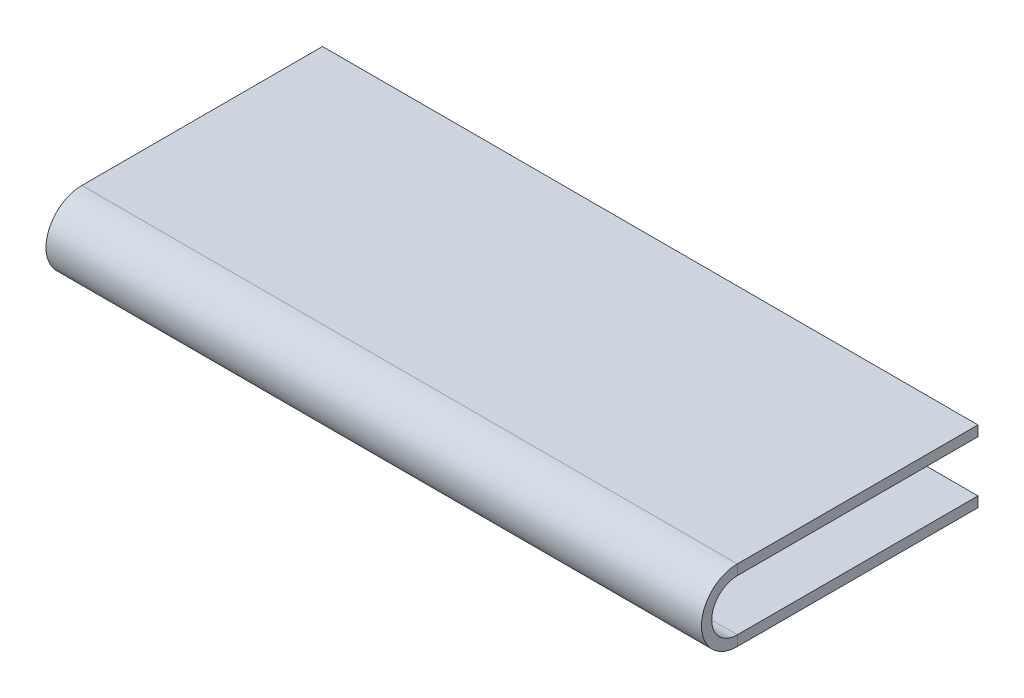
ISO-10303-21;
HEADER;
FILE_DESCRIPTION(('STEP AP214'),'2;1');
FILE_NAME('part.step','',(''),(''),'','','');
FILE_SCHEMA(('AUTOMOTIVE_DESIGN { 1 0 10303 214 1 1 1 1 }'));
ENDSEC;
DATA;
#1=APPLICATION_CONTEXT('core data for automotive mechanical design processes');
#2=APPLICATION_PROTOCOL_DEFINITION('international standard','automotive_design',2000,#1);
#3=PRODUCT_CONTEXT('',#1,'mechanical');
#4=PRODUCT('Part','Part','',(#3));
#5=PRODUCT_RELATED_PRODUCT_CATEGORY('part','',(#4));
#6=PRODUCT_DEFINITION_FORMATION('','',#4);
#7=PRODUCT_DEFINITION_CONTEXT('part definition',#1,'design');
#8=PRODUCT_DEFINITION('design','',#6,#7);
#9=PRODUCT_DEFINITION_SHAPE('','',#8);
#10=(LENGTH_UNIT() NAMED_UNIT(*) SI_UNIT(.MILLI.,.METRE.));
#11=(NAMED_UNIT(*) PLANE_ANGLE_UNIT() SI_UNIT($,.RADIAN.));
#12=(NAMED_UNIT(*) SI_UNIT($,.STERADIAN.) SOLID_ANGLE_UNIT());
#13=UNCERTAINTY_MEASURE_WITH_UNIT(LENGTH_MEASURE(1.E-05),#10,'distance_accuracy_value','');
#14=(GEOMETRIC_REPRESENTATION_CONTEXT(3) GLOBAL_UNCERTAINTY_ASSIGNED_CONTEXT((#13)) GLOBAL_UNIT_ASSIGNED_CONTEXT((#10,
#11,#12)) REPRESENTATION_CONTEXT('',''));
#15=CARTESIAN_POINT('',(0.,0.,0.));
#16=DIRECTION('',(0.,0.,1.));
#17=DIRECTION('',(1.,0.,0.));
#18=AXIS2_PLACEMENT_3D('',#15,#16,#17);
#19=CARTESIAN_POINT('',(64.,0.,23.5));
#20=DIRECTION('',(1.,0.,0.));
#21=DIRECTION('',(0.,0.,-1.));
#22=AXIS2_PLACEMENT_3D('',#19,#20,#21);
#23=PLANE('',#22);
#24=DIRECTION('',(0.,-1.,0.));
#25=VECTOR('',#24,1.);
#26=CARTESIAN_POINT('',(64.,0.,23.5));
#27=LINE('',#26,#25);
#28=CARTESIAN_POINT('',(64.,0.,23.5));
#29=VERTEX_POINT('',#28);
#30=CARTESIAN_POINT('',(64.,-0.999999999999999,23.5));
#31=VERTEX_POINT('',#30);
#32=EDGE_CURVE('E11',#29,#31,#27,.T.);
#33=ORIENTED_EDGE('',*,*,#32,.F.);
#34=CARTESIAN_POINT('',(64.,2.5,23.5));
#35=DIRECTION('',(1.,0.,0.));
#36=DIRECTION('',(0.,0.,-1.));
#37=AXIS2_PLACEMENT_3D('',#34,#35,#36);
#38=CIRCLE('',#37,2.5);
#39=CARTESIAN_POINT('',(64.,4.99999999999999,23.5));
#40=VERTEX_POINT('',#39);
#41=EDGE_CURVE('E137',#40,#29,#38,.T.);
#42=ORIENTED_EDGE('',*,*,#41,.F.);
#43=DIRECTION('',(0.,-1.,0.));
#44=VECTOR('',#43,1.);
#45=CARTESIAN_POINT('',(64.,5.99999999999999,23.5));
#46=LINE('',#45,#44);
#47=CARTESIAN_POINT('',(64.,5.99999999999999,23.5));
#48=VERTEX_POINT('',#47);
#49=EDGE_CURVE('E51',#48,#40,#46,.T.);
#50=ORIENTED_EDGE('',*,*,#49,.F.);
#51=CARTESIAN_POINT('',(64.,2.5,23.5));
#52=DIRECTION('',(1.,0.,0.));
#53=DIRECTION('',(0.,1.,0.));
#54=AXIS2_PLACEMENT_3D('',#51,#52,#53);
#55=CIRCLE('',#54,3.5);
#56=EDGE_CURVE('E134',#48,#31,#55,.T.);
#57=ORIENTED_EDGE('',*,*,#56,.T.);
#58=EDGE_LOOP('',(#33,#42,#50,#57));
#59=FACE_BOUND('',#58,.T.);
#60=ADVANCED_FACE('F43',(#59),#23,.T.);
#61=CARTESIAN_POINT('',(64.,5.99999999999999,23.5));
#62=DIRECTION('',(1.,0.,0.));
#63=DIRECTION('',(0.,0.,-1.));
#64=AXIS2_PLACEMENT_3D('',#61,#62,#63);
#65=PLANE('',#64);
#66=DIRECTION('',(0.,0.,-1.));
#67=VECTOR('',#66,1.);
#68=CARTESIAN_POINT('',(64.,0.,0.));
#69=LINE('',#68,#67);
#70=CARTESIAN_POINT('',(64.,0.,0.));
#71=VERTEX_POINT('',#70);
#72=EDGE_CURVE('E188',#29,#71,#69,.T.);
#73=ORIENTED_EDGE('',*,*,#72,.F.);
#74=ORIENTED_EDGE('',*,*,#32,.T.);
#75=DIRECTION('',(0.,0.,-1.));
#76=VECTOR('',#75,1.);
#77=CARTESIAN_POINT('',(64.,-1.,0.));
#78=LINE('',#77,#76);
#79=CARTESIAN_POINT('',(64.,-1.,0.));
#80=VERTEX_POINT('',#79);
#81=EDGE_CURVE('E97',#31,#80,#78,.T.);
#82=ORIENTED_EDGE('',*,*,#81,.T.);
#83=DIRECTION('',(0.,-1.,0.));
#84=VECTOR('',#83,1.);
#85=CARTESIAN_POINT('',(64.,0.,0.));
#86=LINE('',#85,#84);
#87=EDGE_CURVE('E347',#71,#80,#86,.T.);
#88=ORIENTED_EDGE('',*,*,#87,.F.);
#89=EDGE_LOOP('',(#73,#74,#82,#88));
#90=FACE_BOUND('',#89,.T.);
#91=ADVANCED_FACE('F197',(#90),#65,.T.);
#92=CARTESIAN_POINT('',(0.,4.99999999999999,23.5));
#93=DIRECTION('',(-1.,0.,0.));
#94=DIRECTION('',(0.,0.,1.));
#95=AXIS2_PLACEMENT_3D('',#92,#93,#94);
#96=PLANE('',#95);
#97=DIRECTION('',(0.,1.,0.));
#98=VECTOR('',#97,1.);
#99=CARTESIAN_POINT('',(0.,4.99999999999999,23.5));
#100=LINE('',#99,#98);
#101=CARTESIAN_POINT('',(0.,4.99999999999999,23.5));
#102=VERTEX_POINT('',#101);
#103=CARTESIAN_POINT('',(0.,5.99999999999999,23.5));
#104=VERTEX_POINT('',#103);
#105=EDGE_CURVE('E88',#102,#104,#100,.T.);
#106=ORIENTED_EDGE('',*,*,#105,.F.);
#107=CARTESIAN_POINT('',(0.,2.5,23.5));
#108=DIRECTION('',(1.,0.,0.));
#109=DIRECTION('',(0.,0.,-1.));
#110=AXIS2_PLACEMENT_3D('',#107,#108,#109);
#111=CIRCLE('',#110,2.5);
#112=CARTESIAN_POINT('',(0.,0.,23.5));
#113=VERTEX_POINT('',#112);
#114=EDGE_CURVE('E154',#102,#113,#111,.T.);
#115=ORIENTED_EDGE('',*,*,#114,.T.);
#116=DIRECTION('',(0.,1.,0.));
#117=VECTOR('',#116,1.);
#118=CARTESIAN_POINT('',(0.,-0.999999999999999,23.5));
#119=LINE('',#118,#117);
#120=CARTESIAN_POINT('',(0.,-0.999999999999999,23.5));
#121=VERTEX_POINT('',#120);
#122=EDGE_CURVE('E91',#121,#113,#119,.T.);
#123=ORIENTED_EDGE('',*,*,#122,.F.);
#124=CARTESIAN_POINT('',(0.,2.5,23.5));
#125=DIRECTION('',(1.,0.,0.));
#126=DIRECTION('',(0.,1.,0.));
#127=AXIS2_PLACEMENT_3D('',#124,#125,#126);
#128=CIRCLE('',#127,3.5);
#129=EDGE_CURVE('E165',#104,#121,#128,.T.);
#130=ORIENTED_EDGE('',*,*,#129,.F.);
#131=EDGE_LOOP('',(#106,#115,#123,#130));
#132=FACE_BOUND('',#131,.T.);
#133=ADVANCED_FACE('F192',(#132),#96,.T.);
#134=CARTESIAN_POINT('',(0.,-0.999999999999999,23.5));
#135=DIRECTION('',(-1.,0.,0.));
#136=DIRECTION('',(0.,0.,1.));
#137=AXIS2_PLACEMENT_3D('',#134,#135,#136);
#138=PLANE('',#137);
#139=DIRECTION('',(0.,0.,1.));
#140=VECTOR('',#139,1.);
#141=CARTESIAN_POINT('',(0.,5.,0.));
#142=LINE('',#141,#140);
#143=CARTESIAN_POINT('',(0.,5.,0.));
#144=VERTEX_POINT('',#143);
#145=EDGE_CURVE('E160',#144,#102,#142,.T.);
#146=ORIENTED_EDGE('',*,*,#145,.T.);
#147=ORIENTED_EDGE('',*,*,#105,.T.);
#148=DIRECTION('',(0.,0.,1.));
#149=VECTOR('',#148,1.);
#150=CARTESIAN_POINT('',(0.,6.,0.));
#151=LINE('',#150,#149);
#152=CARTESIAN_POINT('',(0.,6.,0.));
#153=VERTEX_POINT('',#152);
#154=EDGE_CURVE('E159',#153,#104,#151,.T.);
#155=ORIENTED_EDGE('',*,*,#154,.F.);
#156=DIRECTION('',(0.,-1.,0.));
#157=VECTOR('',#156,1.);
#158=CARTESIAN_POINT('',(0.,6.,0.));
#159=LINE('',#158,#157);
#160=EDGE_CURVE('E121',#153,#144,#159,.T.);
#161=ORIENTED_EDGE('',*,*,#160,.T.);
#162=EDGE_LOOP('',(#146,#147,#155,#161));
#163=FACE_BOUND('',#162,.T.);
#164=ADVANCED_FACE('F193',(#163),#138,.T.);
#165=CARTESIAN_POINT('',(64.,-1.,0.));
#166=DIRECTION('',(0.,1.,0.));
#167=DIRECTION('',(0.,0.,1.));
#168=AXIS2_PLACEMENT_3D('',#165,#166,#167);
#169=PLANE('',#168);
#170=DIRECTION('',(0.,0.,-1.));
#171=VECTOR('',#170,1.);
#172=CARTESIAN_POINT('',(0.,-1.,0.));
#173=LINE('',#172,#171);
#174=CARTESIAN_POINT('',(0.,-1.,0.));
#175=VERTEX_POINT('',#174);
#176=EDGE_CURVE('E148',#121,#175,#173,.T.);
#177=ORIENTED_EDGE('',*,*,#176,.T.);
#178=DIRECTION('',(-1.,0.,0.));
#179=VECTOR('',#178,1.);
#180=CARTESIAN_POINT('',(64.,-1.,0.));
#181=LINE('',#180,#179);
#182=EDGE_CURVE('E176',#80,#175,#181,.T.);
#183=ORIENTED_EDGE('',*,*,#182,.F.);
#184=ORIENTED_EDGE('',*,*,#81,.F.);
#185=DIRECTION('',(-1.,0.,0.));
#186=VECTOR('',#185,1.);
#187=CARTESIAN_POINT('',(64.,-0.999999999999999,23.5));
#188=LINE('',#187,#186);
#189=EDGE_CURVE('E144',#31,#121,#188,.T.);
#190=ORIENTED_EDGE('',*,*,#189,.T.);
#191=EDGE_LOOP('',(#177,#183,#184,#190));
#192=FACE_BOUND('',#191,.T.);
#193=ADVANCED_FACE('F201',(#192),#169,.F.);
#194=CARTESIAN_POINT('',(64.,0.,0.));
#195=DIRECTION('',(0.,0.,-1.));
#196=DIRECTION('',(0.,1.,0.));
#197=AXIS2_PLACEMENT_3D('',#194,#195,#196);
#198=PLANE('',#197);
#199=DIRECTION('',(0.,-1.,0.));
#200=VECTOR('',#199,1.);
#201=CARTESIAN_POINT('',(0.,0.,0.));
#202=LINE('',#201,#200);
#203=CARTESIAN_POINT('',(0.,0.,0.));
#204=VERTEX_POINT('',#203);
#205=EDGE_CURVE('E149',#204,#175,#202,.T.);
#206=ORIENTED_EDGE('',*,*,#205,.F.);
#207=DIRECTION('',(-1.,0.,0.));
#208=VECTOR('',#207,1.);
#209=CARTESIAN_POINT('',(64.,0.,0.));
#210=LINE('',#209,#208);
#211=EDGE_CURVE('E174',#71,#204,#210,.T.);
#212=ORIENTED_EDGE('',*,*,#211,.F.);
#213=ORIENTED_EDGE('',*,*,#87,.T.);
#214=ORIENTED_EDGE('',*,*,#182,.T.);
#215=EDGE_LOOP('',(#206,#212,#213,#214));
#216=FACE_BOUND('',#215,.T.);
#217=ADVANCED_FACE('F237',(#216),#198,.T.);
#218=CARTESIAN_POINT('',(64.,0.,0.));
#219=DIRECTION('',(0.,1.,0.));
#220=DIRECTION('',(0.,0.,1.));
#221=AXIS2_PLACEMENT_3D('',#218,#219,#220);
#222=PLANE('',#221);
#223=DIRECTION('',(0.,0.,-1.));
#224=VECTOR('',#223,1.);
#225=CARTESIAN_POINT('',(0.,0.,0.));
#226=LINE('',#225,#224);
#227=EDGE_CURVE('E155',#113,#204,#226,.T.);
#228=ORIENTED_EDGE('',*,*,#227,.F.);
#229=DIRECTION('',(-1.,0.,0.));
#230=VECTOR('',#229,1.);
#231=CARTESIAN_POINT('',(64.,0.,23.5));
#232=LINE('',#231,#230);
#233=EDGE_CURVE('E173',#29,#113,#232,.T.);
#234=ORIENTED_EDGE('',*,*,#233,.F.);
#235=ORIENTED_EDGE('',*,*,#72,.T.);
#236=ORIENTED_EDGE('',*,*,#211,.T.);
#237=EDGE_LOOP('',(#228,#234,#235,#236));
#238=FACE_BOUND('',#237,.T.);
#239=ADVANCED_FACE('F250',(#238),#222,.T.);
#240=CARTESIAN_POINT('',(64.,2.5,23.5));
#241=DIRECTION('',(-1.,0.,0.));
#242=DIRECTION('',(0.,0.,1.));
#243=AXIS2_PLACEMENT_3D('',#240,#241,#242);
#244=CYLINDRICAL_SURFACE('',#243,2.5);
#245=ORIENTED_EDGE('',*,*,#114,.F.);
#246=DIRECTION('',(-1.,0.,0.));
#247=VECTOR('',#246,1.);
#248=CARTESIAN_POINT('',(64.,4.99999999999999,23.5));
#249=LINE('',#248,#247);
#250=EDGE_CURVE('E169',#40,#102,#249,.T.);
#251=ORIENTED_EDGE('',*,*,#250,.F.);
#252=ORIENTED_EDGE('',*,*,#41,.T.);
#253=ORIENTED_EDGE('',*,*,#233,.T.);
#254=EDGE_LOOP('',(#245,#251,#252,#253));
#255=FACE_BOUND('',#254,.T.);
#256=ADVANCED_FACE('F183',(#255),#244,.F.);
#257=CARTESIAN_POINT('',(64.,5.,0.));
#258=DIRECTION('',(0.,-1.,0.));
#259=DIRECTION('',(0.,0.,-1.));
#260=AXIS2_PLACEMENT_3D('',#257,#258,#259);
#261=PLANE('',#260);
#262=ORIENTED_EDGE('',*,*,#145,.F.);
#263=DIRECTION('',(-1.,0.,0.));
#264=VECTOR('',#263,1.);
#265=CARTESIAN_POINT('',(64.,5.,0.));
#266=LINE('',#265,#264);
#267=CARTESIAN_POINT('',(64.,5.,0.));
#268=VERTEX_POINT('',#267);
#269=EDGE_CURVE('E124',#268,#144,#266,.T.);
#270=ORIENTED_EDGE('',*,*,#269,.F.);
#271=DIRECTION('',(0.,0.,1.));
#272=VECTOR('',#271,1.);
#273=CARTESIAN_POINT('',(64.,5.,0.));
#274=LINE('',#273,#272);
#275=EDGE_CURVE('E136',#268,#40,#274,.T.);
#276=ORIENTED_EDGE('',*,*,#275,.T.);
#277=ORIENTED_EDGE('',*,*,#250,.T.);
#278=EDGE_LOOP('',(#262,#270,#276,#277));
#279=FACE_BOUND('',#278,.T.);
#280=ADVANCED_FACE('F190',(#279),#261,.T.);
#281=CARTESIAN_POINT('',(64.,6.,0.));
#282=DIRECTION('',(0.,0.,-1.));
#283=DIRECTION('',(0.,1.,0.));
#284=AXIS2_PLACEMENT_3D('',#281,#282,#283);
#285=PLANE('',#284);
#286=ORIENTED_EDGE('',*,*,#160,.F.);
#287=DIRECTION('',(-1.,0.,0.));
#288=VECTOR('',#287,1.);
#289=CARTESIAN_POINT('',(64.,6.,0.));
#290=LINE('',#289,#288);
#291=CARTESIAN_POINT('',(64.,6.,0.));
#292=VERTEX_POINT('',#291);
#293=EDGE_CURVE('E113',#292,#153,#290,.T.);
#294=ORIENTED_EDGE('',*,*,#293,.F.);
#295=DIRECTION('',(0.,-1.,0.));
#296=VECTOR('',#295,1.);
#297=CARTESIAN_POINT('',(64.,6.,0.));
#298=LINE('',#297,#296);
#299=EDGE_CURVE('E119',#292,#268,#298,.T.);
#300=ORIENTED_EDGE('',*,*,#299,.T.);
#301=ORIENTED_EDGE('',*,*,#269,.T.);
#302=EDGE_LOOP('',(#286,#294,#300,#301));
#303=FACE_BOUND('',#302,.T.);
#304=ADVANCED_FACE('F120',(#303),#285,.T.);
#305=CARTESIAN_POINT('',(64.,6.,0.));
#306=DIRECTION('',(0.,-1.,0.));
#307=DIRECTION('',(0.,0.,-1.));
#308=AXIS2_PLACEMENT_3D('',#305,#306,#307);
#309=PLANE('',#308);
#310=ORIENTED_EDGE('',*,*,#154,.T.);
#311=DIRECTION('',(-1.,0.,0.));
#312=VECTOR('',#311,1.);
#313=CARTESIAN_POINT('',(64.,5.99999999999999,23.5));
#314=LINE('',#313,#312);
#315=EDGE_CURVE('E123',#48,#104,#314,.T.);
#316=ORIENTED_EDGE('',*,*,#315,.F.);
#317=DIRECTION('',(0.,0.,1.));
#318=VECTOR('',#317,1.);
#319=CARTESIAN_POINT('',(64.,6.,0.));
#320=LINE('',#319,#318);
#321=EDGE_CURVE('E126',#292,#48,#320,.T.);
#322=ORIENTED_EDGE('',*,*,#321,.F.);
#323=ORIENTED_EDGE('',*,*,#293,.T.);
#324=EDGE_LOOP('',(#310,#316,#322,#323));
#325=FACE_BOUND('',#324,.T.);
#326=ADVANCED_FACE('F129',(#325),#309,.F.);
#327=CARTESIAN_POINT('',(64.,2.5,23.5));
#328=DIRECTION('',(-1.,0.,0.));
#329=DIRECTION('',(0.,0.,1.));
#330=AXIS2_PLACEMENT_3D('',#327,#328,#329);
#331=CYLINDRICAL_SURFACE('',#330,3.5);
#332=ORIENTED_EDGE('',*,*,#129,.T.);
#333=ORIENTED_EDGE('',*,*,#189,.F.);
#334=ORIENTED_EDGE('',*,*,#56,.F.);
#335=ORIENTED_EDGE('',*,*,#315,.T.);
#336=EDGE_LOOP('',(#332,#333,#334,#335));
#337=FACE_BOUND('',#336,.T.);
#338=ADVANCED_FACE('F191',(#337),#331,.T.);
#339=CARTESIAN_POINT('',(64.,2.5,23.5));
#340=DIRECTION('',(1.,0.,0.));
#341=DIRECTION('',(0.,1.,0.));
#342=AXIS2_PLACEMENT_3D('',#339,#340,#341);
#343=PLANE('',#342);
#344=ORIENTED_EDGE('',*,*,#321,.T.);
#345=ORIENTED_EDGE('',*,*,#49,.T.);
#346=ORIENTED_EDGE('',*,*,#275,.F.);
#347=ORIENTED_EDGE('',*,*,#299,.F.);
#348=EDGE_LOOP('',(#344,#345,#346,#347));
#349=FACE_BOUND('',#348,.T.);
#350=ADVANCED_FACE('F138',(#349),#343,.T.);
#351=CARTESIAN_POINT('',(0.,2.5,23.5));
#352=DIRECTION('',(1.,0.,0.));
#353=DIRECTION('',(0.,1.,0.));
#354=AXIS2_PLACEMENT_3D('',#351,#352,#353);
#355=PLANE('',#354);
#356=ORIENTED_EDGE('',*,*,#176,.F.);
#357=ORIENTED_EDGE('',*,*,#122,.T.);
#358=ORIENTED_EDGE('',*,*,#227,.T.);
#359=ORIENTED_EDGE('',*,*,#205,.T.);
#360=EDGE_LOOP('',(#356,#357,#358,#359));
#361=FACE_BOUND('',#360,.T.);
#362=ADVANCED_FACE('F311',(#361),#355,.F.);
#363=CLOSED_SHELL('',(#60,#91,#133,#164,#193,#217,#239,#256,#280,#304,#326,#338,#350,#362));
#364=MANIFOLD_SOLID_BREP('B2',#363);
#365=ADVANCED_BREP_SHAPE_REPRESENTATION('',(#18,#364),#14);
#366=SHAPE_DEFINITION_REPRESENTATION(#9,#365);
ENDSEC;
END-ISO-10303-21;
